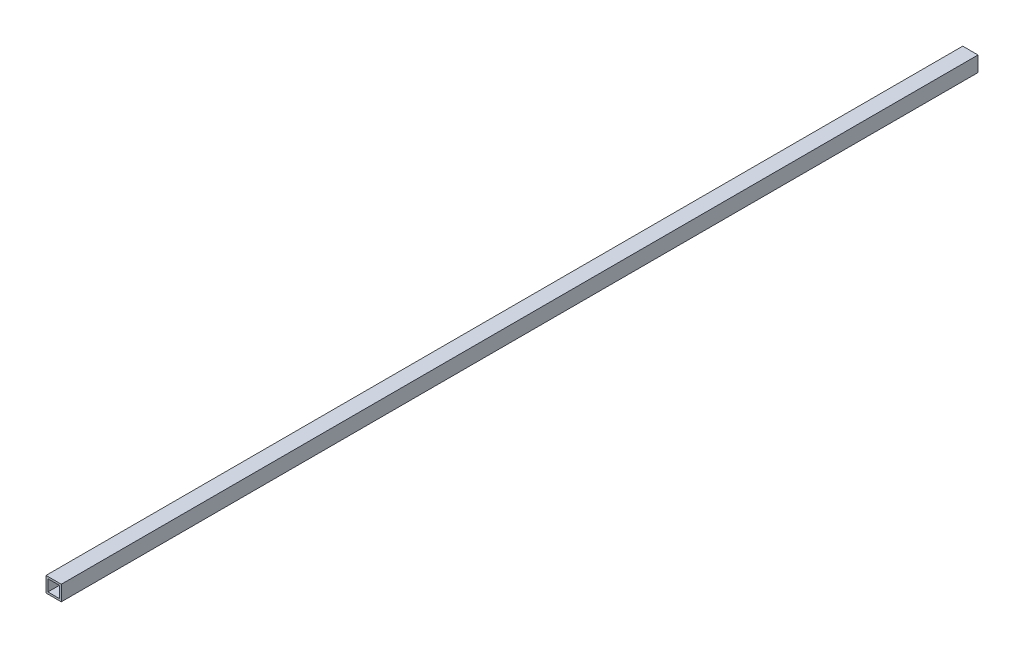
ISO-10303-21;
HEADER;
FILE_DESCRIPTION(('STEP AP214'),'2;1');
FILE_NAME('part.step','',(''),(''),'','','');
FILE_SCHEMA(('AUTOMOTIVE_DESIGN { 1 0 10303 214 1 1 1 1 }'));
ENDSEC;
DATA;
#1=APPLICATION_CONTEXT('core data for automotive mechanical design processes');
#2=APPLICATION_PROTOCOL_DEFINITION('international standard','automotive_design',2000,#1);
#3=PRODUCT_CONTEXT('',#1,'mechanical');
#4=PRODUCT('Part','Part','',(#3));
#5=PRODUCT_RELATED_PRODUCT_CATEGORY('part','',(#4));
#6=PRODUCT_DEFINITION_FORMATION('','',#4);
#7=PRODUCT_DEFINITION_CONTEXT('part definition',#1,'design');
#8=PRODUCT_DEFINITION('design','',#6,#7);
#9=PRODUCT_DEFINITION_SHAPE('','',#8);
#10=(LENGTH_UNIT() NAMED_UNIT(*) SI_UNIT(.MILLI.,.METRE.));
#11=(NAMED_UNIT(*) PLANE_ANGLE_UNIT() SI_UNIT($,.RADIAN.));
#12=(NAMED_UNIT(*) SI_UNIT($,.STERADIAN.) SOLID_ANGLE_UNIT());
#13=UNCERTAINTY_MEASURE_WITH_UNIT(LENGTH_MEASURE(1.E-05),#10,'distance_accuracy_value','');
#14=(GEOMETRIC_REPRESENTATION_CONTEXT(3) GLOBAL_UNCERTAINTY_ASSIGNED_CONTEXT((#13)) GLOBAL_UNIT_ASSIGNED_CONTEXT((#10,
#11,#12)) REPRESENTATION_CONTEXT('',''));
#15=CARTESIAN_POINT('',(0.,0.,0.));
#16=DIRECTION('',(0.,0.,1.));
#17=DIRECTION('',(1.,0.,0.));
#18=AXIS2_PLACEMENT_3D('',#15,#16,#17);
#19=CARTESIAN_POINT('',(0.,0.,381.));
#20=DIRECTION('',(0.,0.,-1.));
#21=DIRECTION('',(-1.,0.,0.));
#22=AXIS2_PLACEMENT_3D('',#19,#20,#21);
#23=PLANE('',#22);
#24=DIRECTION('',(0.,1.,0.));
#25=VECTOR('',#24,1.);
#26=CARTESIAN_POINT('',(330.2,101.6,381.));
#27=LINE('',#26,#25);
#28=CARTESIAN_POINT('',(330.2,88.9,381.));
#29=VERTEX_POINT('',#28);
#30=CARTESIAN_POINT('',(330.2,101.6,381.));
#31=VERTEX_POINT('',#30);
#32=EDGE_CURVE('E111',#29,#31,#27,.T.);
#33=ORIENTED_EDGE('',*,*,#32,.T.);
#34=DIRECTION('',(-1.,0.,0.));
#35=VECTOR('',#34,1.);
#36=CARTESIAN_POINT('',(330.2,101.6,381.));
#37=LINE('',#36,#35);
#38=CARTESIAN_POINT('',(317.5,101.6,381.));
#39=VERTEX_POINT('',#38);
#40=EDGE_CURVE('E154',#31,#39,#37,.T.);
#41=ORIENTED_EDGE('',*,*,#40,.T.);
#42=DIRECTION('',(0.,-1.,0.));
#43=VECTOR('',#42,1.);
#44=CARTESIAN_POINT('',(317.5,101.6,381.));
#45=LINE('',#44,#43);
#46=CARTESIAN_POINT('',(317.5,88.8999999999999,381.));
#47=VERTEX_POINT('',#46);
#48=EDGE_CURVE('E156',#39,#47,#45,.T.);
#49=ORIENTED_EDGE('',*,*,#48,.T.);
#50=DIRECTION('',(1.,0.,0.));
#51=VECTOR('',#50,1.);
#52=CARTESIAN_POINT('',(330.2,88.9,381.));
#53=LINE('',#52,#51);
#54=EDGE_CURVE('E58',#47,#29,#53,.T.);
#55=ORIENTED_EDGE('',*,*,#54,.T.);
#56=EDGE_LOOP('',(#33,#41,#49,#55));
#57=FACE_BOUND('',#56,.T.);
#58=DIRECTION('',(0.,1.,0.));
#59=VECTOR('',#58,1.);
#60=CARTESIAN_POINT('',(328.6125,100.0125,381.));
#61=LINE('',#60,#59);
#62=CARTESIAN_POINT('',(328.6125,90.4875,381.));
#63=VERTEX_POINT('',#62);
#64=CARTESIAN_POINT('',(328.6125,100.0125,381.));
#65=VERTEX_POINT('',#64);
#66=EDGE_CURVE('E108',#63,#65,#61,.T.);
#67=ORIENTED_EDGE('',*,*,#66,.F.);
#68=DIRECTION('',(1.,0.,0.));
#69=VECTOR('',#68,1.);
#70=CARTESIAN_POINT('',(328.6125,90.4875,381.));
#71=LINE('',#70,#69);
#72=CARTESIAN_POINT('',(319.0875,90.4875,381.));
#73=VERTEX_POINT('',#72);
#74=EDGE_CURVE('E147',#73,#63,#71,.T.);
#75=ORIENTED_EDGE('',*,*,#74,.F.);
#76=DIRECTION('',(0.,-1.,0.));
#77=VECTOR('',#76,1.);
#78=CARTESIAN_POINT('',(319.0875,100.0125,381.));
#79=LINE('',#78,#77);
#80=CARTESIAN_POINT('',(319.0875,100.0125,381.));
#81=VERTEX_POINT('',#80);
#82=EDGE_CURVE('E145',#81,#73,#79,.T.);
#83=ORIENTED_EDGE('',*,*,#82,.F.);
#84=DIRECTION('',(-1.,0.,0.));
#85=VECTOR('',#84,1.);
#86=CARTESIAN_POINT('',(328.6125,100.0125,381.));
#87=LINE('',#86,#85);
#88=EDGE_CURVE('E143',#65,#81,#87,.T.);
#89=ORIENTED_EDGE('',*,*,#88,.F.);
#90=EDGE_LOOP('',(#67,#75,#83,#89));
#91=FACE_BOUND('',#90,.T.);
#92=ADVANCED_FACE('F35',(#57,#91),#23,.F.);
#93=CARTESIAN_POINT('',(330.2,101.6,381.));
#94=DIRECTION('',(-1.,0.,0.));
#95=DIRECTION('',(0.,-1.,0.));
#96=AXIS2_PLACEMENT_3D('',#93,#94,#95);
#97=PLANE('',#96);
#98=DIRECTION('',(0.,0.,-1.));
#99=VECTOR('',#98,1.);
#100=CARTESIAN_POINT('',(330.2,88.9,381.));
#101=LINE('',#100,#99);
#102=CARTESIAN_POINT('',(330.2,88.9,-381.));
#103=VERTEX_POINT('',#102);
#104=EDGE_CURVE('E159',#29,#103,#101,.T.);
#105=ORIENTED_EDGE('',*,*,#104,.T.);
#106=DIRECTION('',(0.,1.,0.));
#107=VECTOR('',#106,1.);
#108=CARTESIAN_POINT('',(330.2,101.6,-381.));
#109=LINE('',#108,#107);
#110=CARTESIAN_POINT('',(330.2,101.6,-381.));
#111=VERTEX_POINT('',#110);
#112=EDGE_CURVE('E130',#103,#111,#109,.T.);
#113=ORIENTED_EDGE('',*,*,#112,.T.);
#114=DIRECTION('',(0.,0.,-1.));
#115=VECTOR('',#114,1.);
#116=CARTESIAN_POINT('',(330.2,101.6,381.));
#117=LINE('',#116,#115);
#118=EDGE_CURVE('E11',#31,#111,#117,.T.);
#119=ORIENTED_EDGE('',*,*,#118,.F.);
#120=ORIENTED_EDGE('',*,*,#32,.F.);
#121=EDGE_LOOP('',(#105,#113,#119,#120));
#122=FACE_BOUND('',#121,.T.);
#123=ADVANCED_FACE('F37',(#122),#97,.F.);
#124=CARTESIAN_POINT('',(330.2,101.6,381.));
#125=DIRECTION('',(0.,-1.,0.));
#126=DIRECTION('',(0.,0.,-1.));
#127=AXIS2_PLACEMENT_3D('',#124,#125,#126);
#128=PLANE('',#127);
#129=ORIENTED_EDGE('',*,*,#118,.T.);
#130=DIRECTION('',(-1.,0.,0.));
#131=VECTOR('',#130,1.);
#132=CARTESIAN_POINT('',(330.2,101.6,-381.));
#133=LINE('',#132,#131);
#134=CARTESIAN_POINT('',(317.5,101.6,-381.));
#135=VERTEX_POINT('',#134);
#136=EDGE_CURVE('E133',#111,#135,#133,.T.);
#137=ORIENTED_EDGE('',*,*,#136,.T.);
#138=DIRECTION('',(0.,0.,-1.));
#139=VECTOR('',#138,1.);
#140=CARTESIAN_POINT('',(317.5,101.6,381.));
#141=LINE('',#140,#139);
#142=EDGE_CURVE('E43',#39,#135,#141,.T.);
#143=ORIENTED_EDGE('',*,*,#142,.F.);
#144=ORIENTED_EDGE('',*,*,#40,.F.);
#145=EDGE_LOOP('',(#129,#137,#143,#144));
#146=FACE_BOUND('',#145,.T.);
#147=ADVANCED_FACE('F172',(#146),#128,.F.);
#148=CARTESIAN_POINT('',(317.5,101.6,381.));
#149=DIRECTION('',(1.,0.,0.));
#150=DIRECTION('',(0.,1.,0.));
#151=AXIS2_PLACEMENT_3D('',#148,#149,#150);
#152=PLANE('',#151);
#153=ORIENTED_EDGE('',*,*,#142,.T.);
#154=DIRECTION('',(0.,-1.,0.));
#155=VECTOR('',#154,1.);
#156=CARTESIAN_POINT('',(317.5,101.6,-381.));
#157=LINE('',#156,#155);
#158=CARTESIAN_POINT('',(317.5,88.8999999999999,-381.));
#159=VERTEX_POINT('',#158);
#160=EDGE_CURVE('E136',#135,#159,#157,.T.);
#161=ORIENTED_EDGE('',*,*,#160,.T.);
#162=DIRECTION('',(0.,0.,-1.));
#163=VECTOR('',#162,1.);
#164=CARTESIAN_POINT('',(317.5,88.8999999999999,381.));
#165=LINE('',#164,#163);
#166=EDGE_CURVE('E161',#47,#159,#165,.T.);
#167=ORIENTED_EDGE('',*,*,#166,.F.);
#168=ORIENTED_EDGE('',*,*,#48,.F.);
#169=EDGE_LOOP('',(#153,#161,#167,#168));
#170=FACE_BOUND('',#169,.T.);
#171=ADVANCED_FACE('F166',(#170),#152,.F.);
#172=CARTESIAN_POINT('',(330.2,88.9,381.));
#173=DIRECTION('',(0.,1.,0.));
#174=DIRECTION('',(-1.,0.,0.));
#175=AXIS2_PLACEMENT_3D('',#172,#173,#174);
#176=PLANE('',#175);
#177=ORIENTED_EDGE('',*,*,#166,.T.);
#178=DIRECTION('',(1.,0.,0.));
#179=VECTOR('',#178,1.);
#180=CARTESIAN_POINT('',(330.2,88.9,-381.));
#181=LINE('',#180,#179);
#182=EDGE_CURVE('E139',#159,#103,#181,.T.);
#183=ORIENTED_EDGE('',*,*,#182,.T.);
#184=ORIENTED_EDGE('',*,*,#104,.F.);
#185=ORIENTED_EDGE('',*,*,#54,.F.);
#186=EDGE_LOOP('',(#177,#183,#184,#185));
#187=FACE_BOUND('',#186,.T.);
#188=ADVANCED_FACE('F177',(#187),#176,.F.);
#189=CARTESIAN_POINT('',(328.6125,100.0125,381.));
#190=DIRECTION('',(-1.,0.,0.));
#191=DIRECTION('',(0.,0.,1.));
#192=AXIS2_PLACEMENT_3D('',#189,#190,#191);
#193=PLANE('',#192);
#194=DIRECTION('',(0.,0.,-1.));
#195=VECTOR('',#194,1.);
#196=CARTESIAN_POINT('',(328.6125,100.0125,381.));
#197=LINE('',#196,#195);
#198=CARTESIAN_POINT('',(328.6125,100.0125,-381.));
#199=VERTEX_POINT('',#198);
#200=EDGE_CURVE('E100',#65,#199,#197,.T.);
#201=ORIENTED_EDGE('',*,*,#200,.T.);
#202=DIRECTION('',(0.,1.,0.));
#203=VECTOR('',#202,1.);
#204=CARTESIAN_POINT('',(328.6125,100.0125,-381.));
#205=LINE('',#204,#203);
#206=CARTESIAN_POINT('',(328.6125,90.4875,-381.));
#207=VERTEX_POINT('',#206);
#208=EDGE_CURVE('E105',#207,#199,#205,.T.);
#209=ORIENTED_EDGE('',*,*,#208,.F.);
#210=DIRECTION('',(0.,0.,-1.));
#211=VECTOR('',#210,1.);
#212=CARTESIAN_POINT('',(328.6125,90.4875,381.));
#213=LINE('',#212,#211);
#214=EDGE_CURVE('E149',#63,#207,#213,.T.);
#215=ORIENTED_EDGE('',*,*,#214,.F.);
#216=ORIENTED_EDGE('',*,*,#66,.T.);
#217=EDGE_LOOP('',(#201,#209,#215,#216));
#218=FACE_BOUND('',#217,.T.);
#219=ADVANCED_FACE('F102',(#218),#193,.T.);
#220=CARTESIAN_POINT('',(328.6125,100.0125,381.));
#221=DIRECTION('',(0.,-1.,0.));
#222=DIRECTION('',(0.,0.,-1.));
#223=AXIS2_PLACEMENT_3D('',#220,#221,#222);
#224=PLANE('',#223);
#225=DIRECTION('',(0.,0.,-1.));
#226=VECTOR('',#225,1.);
#227=CARTESIAN_POINT('',(319.0875,100.0125,381.));
#228=LINE('',#227,#226);
#229=CARTESIAN_POINT('',(319.0875,100.0125,-381.));
#230=VERTEX_POINT('',#229);
#231=EDGE_CURVE('E112',#81,#230,#228,.T.);
#232=ORIENTED_EDGE('',*,*,#231,.T.);
#233=DIRECTION('',(-1.,0.,0.));
#234=VECTOR('',#233,1.);
#235=CARTESIAN_POINT('',(328.6125,100.0125,-381.));
#236=LINE('',#235,#234);
#237=EDGE_CURVE('E115',#199,#230,#236,.T.);
#238=ORIENTED_EDGE('',*,*,#237,.F.);
#239=ORIENTED_EDGE('',*,*,#200,.F.);
#240=ORIENTED_EDGE('',*,*,#88,.T.);
#241=EDGE_LOOP('',(#232,#238,#239,#240));
#242=FACE_BOUND('',#241,.T.);
#243=ADVANCED_FACE('F116',(#242),#224,.T.);
#244=CARTESIAN_POINT('',(319.0875,100.0125,381.));
#245=DIRECTION('',(1.,0.,0.));
#246=DIRECTION('',(0.,0.,-1.));
#247=AXIS2_PLACEMENT_3D('',#244,#245,#246);
#248=PLANE('',#247);
#249=DIRECTION('',(0.,0.,-1.));
#250=VECTOR('',#249,1.);
#251=CARTESIAN_POINT('',(319.0875,90.4875,381.));
#252=LINE('',#251,#250);
#253=CARTESIAN_POINT('',(319.0875,90.4875,-381.));
#254=VERTEX_POINT('',#253);
#255=EDGE_CURVE('E50',#73,#254,#252,.T.);
#256=ORIENTED_EDGE('',*,*,#255,.T.);
#257=DIRECTION('',(0.,-1.,0.));
#258=VECTOR('',#257,1.);
#259=CARTESIAN_POINT('',(319.0875,100.0125,-381.));
#260=LINE('',#259,#258);
#261=EDGE_CURVE('E121',#230,#254,#260,.T.);
#262=ORIENTED_EDGE('',*,*,#261,.F.);
#263=ORIENTED_EDGE('',*,*,#231,.F.);
#264=ORIENTED_EDGE('',*,*,#82,.T.);
#265=EDGE_LOOP('',(#256,#262,#263,#264));
#266=FACE_BOUND('',#265,.T.);
#267=ADVANCED_FACE('F195',(#266),#248,.T.);
#268=CARTESIAN_POINT('',(328.6125,90.4875,381.));
#269=DIRECTION('',(0.,1.,0.));
#270=DIRECTION('',(0.,0.,1.));
#271=AXIS2_PLACEMENT_3D('',#268,#269,#270);
#272=PLANE('',#271);
#273=ORIENTED_EDGE('',*,*,#214,.T.);
#274=DIRECTION('',(1.,0.,0.));
#275=VECTOR('',#274,1.);
#276=CARTESIAN_POINT('',(328.6125,90.4875,-381.));
#277=LINE('',#276,#275);
#278=EDGE_CURVE('E125',#254,#207,#277,.T.);
#279=ORIENTED_EDGE('',*,*,#278,.F.);
#280=ORIENTED_EDGE('',*,*,#255,.F.);
#281=ORIENTED_EDGE('',*,*,#74,.T.);
#282=EDGE_LOOP('',(#273,#279,#280,#281));
#283=FACE_BOUND('',#282,.T.);
#284=ADVANCED_FACE('F198',(#283),#272,.T.);
#285=CARTESIAN_POINT('',(0.,0.,-381.));
#286=DIRECTION('',(0.,0.,-1.));
#287=DIRECTION('',(-1.,0.,0.));
#288=AXIS2_PLACEMENT_3D('',#285,#286,#287);
#289=PLANE('',#288);
#290=ORIENTED_EDGE('',*,*,#208,.T.);
#291=ORIENTED_EDGE('',*,*,#237,.T.);
#292=ORIENTED_EDGE('',*,*,#261,.T.);
#293=ORIENTED_EDGE('',*,*,#278,.T.);
#294=EDGE_LOOP('',(#290,#291,#292,#293));
#295=FACE_BOUND('',#294,.T.);
#296=ORIENTED_EDGE('',*,*,#112,.F.);
#297=ORIENTED_EDGE('',*,*,#182,.F.);
#298=ORIENTED_EDGE('',*,*,#160,.F.);
#299=ORIENTED_EDGE('',*,*,#136,.F.);
#300=EDGE_LOOP('',(#296,#297,#298,#299));
#301=FACE_BOUND('',#300,.T.);
#302=ADVANCED_FACE('F123',(#295,#301),#289,.T.);
#303=CLOSED_SHELL('',(#92,#123,#147,#171,#188,#219,#243,#267,#284,#302));
#304=MANIFOLD_SOLID_BREP('B2',#303);
#305=ADVANCED_BREP_SHAPE_REPRESENTATION('',(#18,#304),#14);
#306=SHAPE_DEFINITION_REPRESENTATION(#9,#305);
ENDSEC;
END-ISO-10303-21;
